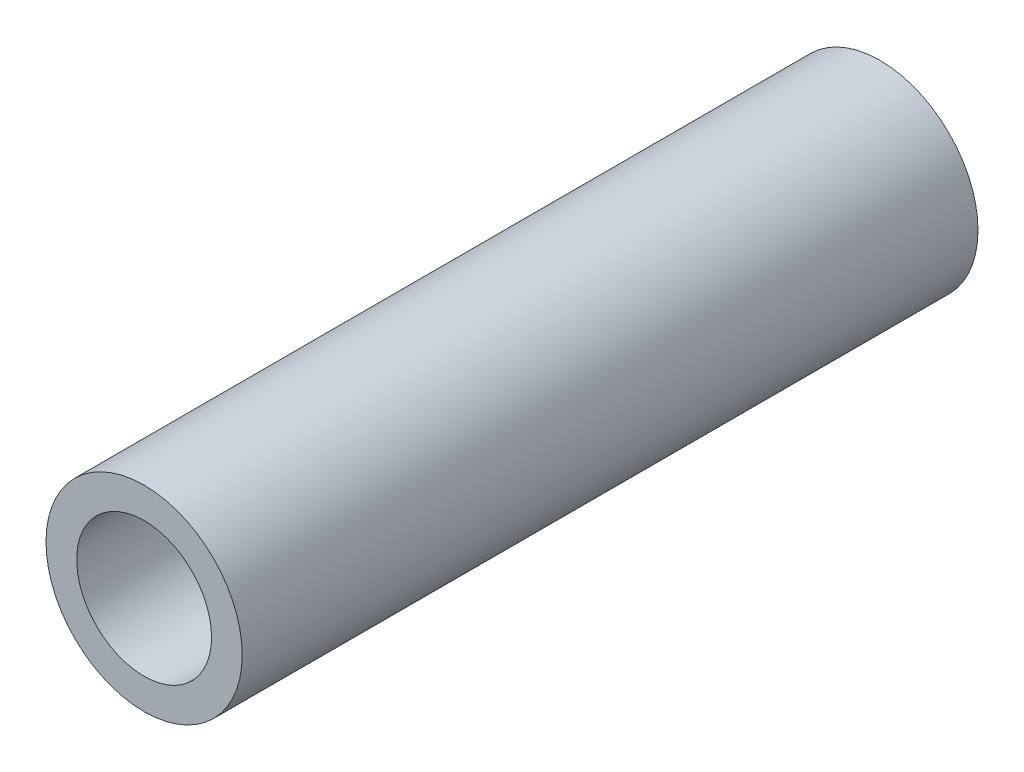
ISO-10303-21;
HEADER;
FILE_DESCRIPTION(('STEP AP214'),'2;1');
FILE_NAME('part.step','',(''),(''),'','','');
FILE_SCHEMA(('AUTOMOTIVE_DESIGN { 1 0 10303 214 1 1 1 1 }'));
ENDSEC;
DATA;
#1=APPLICATION_CONTEXT('core data for automotive mechanical design processes');
#2=APPLICATION_PROTOCOL_DEFINITION('international standard','automotive_design',2000,#1);
#3=PRODUCT_CONTEXT('',#1,'mechanical');
#4=PRODUCT('Part','Part','',(#3));
#5=PRODUCT_RELATED_PRODUCT_CATEGORY('part','',(#4));
#6=PRODUCT_DEFINITION_FORMATION('','',#4);
#7=PRODUCT_DEFINITION_CONTEXT('part definition',#1,'design');
#8=PRODUCT_DEFINITION('design','',#6,#7);
#9=PRODUCT_DEFINITION_SHAPE('','',#8);
#10=(LENGTH_UNIT() NAMED_UNIT(*) SI_UNIT(.MILLI.,.METRE.));
#11=(NAMED_UNIT(*) PLANE_ANGLE_UNIT() SI_UNIT($,.RADIAN.));
#12=(NAMED_UNIT(*) SI_UNIT($,.STERADIAN.) SOLID_ANGLE_UNIT());
#13=UNCERTAINTY_MEASURE_WITH_UNIT(LENGTH_MEASURE(1.E-05),#10,'distance_accuracy_value','');
#14=(GEOMETRIC_REPRESENTATION_CONTEXT(3) GLOBAL_UNCERTAINTY_ASSIGNED_CONTEXT((#13)) GLOBAL_UNIT_ASSIGNED_CONTEXT((#10,
#11,#12)) REPRESENTATION_CONTEXT('',''));
#15=CARTESIAN_POINT('',(0.,0.,0.));
#16=DIRECTION('',(0.,0.,1.));
#17=DIRECTION('',(1.,0.,0.));
#18=AXIS2_PLACEMENT_3D('',#15,#16,#17);
#19=CARTESIAN_POINT('',(0.,0.,-60.));
#20=DIRECTION('',(0.,0.,1.));
#21=DIRECTION('',(1.,0.,0.));
#22=AXIS2_PLACEMENT_3D('',#19,#20,#21);
#23=CYLINDRICAL_SURFACE('',#22,8.);
#24=CARTESIAN_POINT('',(0.,0.,-60.));
#25=DIRECTION('',(0.,0.,1.));
#26=DIRECTION('',(1.,0.,0.));
#27=AXIS2_PLACEMENT_3D('',#24,#25,#26);
#28=CIRCLE('',#27,8.);
#29=CARTESIAN_POINT('',(8.,0.,-60.));
#30=VERTEX_POINT('',#29);
#31=EDGE_CURVE('E10',#30,#30,#28,.T.);
#32=ORIENTED_EDGE('',*,*,#31,.T.);
#33=EDGE_LOOP('',(#32));
#34=FACE_BOUND('',#33,.T.);
#35=CARTESIAN_POINT('',(0.,0.,0.));
#36=DIRECTION('',(0.,0.,1.));
#37=DIRECTION('',(1.,0.,0.));
#38=AXIS2_PLACEMENT_3D('',#35,#36,#37);
#39=CIRCLE('',#38,8.);
#40=CARTESIAN_POINT('',(8.,0.,0.));
#41=VERTEX_POINT('',#40);
#42=EDGE_CURVE('E34',#41,#41,#39,.T.);
#43=ORIENTED_EDGE('',*,*,#42,.F.);
#44=EDGE_LOOP('',(#43));
#45=FACE_BOUND('',#44,.T.);
#46=ADVANCED_FACE('F31',(#34,#45),#23,.T.);
#47=CARTESIAN_POINT('',(0.,0.,-60.));
#48=DIRECTION('',(0.,0.,1.));
#49=DIRECTION('',(1.,0.,0.));
#50=AXIS2_PLACEMENT_3D('',#47,#48,#49);
#51=PLANE('',#50);
#52=CARTESIAN_POINT('',(0.,0.,-60.));
#53=DIRECTION('',(0.,0.,1.));
#54=DIRECTION('',(1.,0.,0.));
#55=AXIS2_PLACEMENT_3D('',#52,#53,#54);
#56=CIRCLE('',#55,5.5);
#57=CARTESIAN_POINT('',(5.5,0.,-60.));
#58=VERTEX_POINT('',#57);
#59=EDGE_CURVE('E41',#58,#58,#56,.T.);
#60=ORIENTED_EDGE('',*,*,#59,.T.);
#61=EDGE_LOOP('',(#60));
#62=FACE_BOUND('',#61,.T.);
#63=ORIENTED_EDGE('',*,*,#31,.F.);
#64=EDGE_LOOP('',(#63));
#65=FACE_BOUND('',#64,.T.);
#66=ADVANCED_FACE('F49',(#62,#65),#51,.F.);
#67=CARTESIAN_POINT('',(0.,0.,0.));
#68=DIRECTION('',(0.,0.,1.));
#69=DIRECTION('',(1.,0.,0.));
#70=AXIS2_PLACEMENT_3D('',#67,#68,#69);
#71=PLANE('',#70);
#72=CARTESIAN_POINT('',(0.,0.,0.));
#73=DIRECTION('',(0.,0.,1.));
#74=DIRECTION('',(1.,0.,0.));
#75=AXIS2_PLACEMENT_3D('',#72,#73,#74);
#76=CIRCLE('',#75,5.5);
#77=CARTESIAN_POINT('',(5.5,0.,0.));
#78=VERTEX_POINT('',#77);
#79=EDGE_CURVE('E43',#78,#78,#76,.T.);
#80=ORIENTED_EDGE('',*,*,#79,.F.);
#81=EDGE_LOOP('',(#80));
#82=FACE_BOUND('',#81,.T.);
#83=ORIENTED_EDGE('',*,*,#42,.T.);
#84=EDGE_LOOP('',(#83));
#85=FACE_BOUND('',#84,.T.);
#86=ADVANCED_FACE('F55',(#82,#85),#71,.T.);
#87=CARTESIAN_POINT('',(0.,0.,-60.));
#88=DIRECTION('',(0.,0.,1.));
#89=DIRECTION('',(1.,0.,0.));
#90=AXIS2_PLACEMENT_3D('',#87,#88,#89);
#91=CYLINDRICAL_SURFACE('',#90,5.5);
#92=ORIENTED_EDGE('',*,*,#59,.F.);
#93=EDGE_LOOP('',(#92));
#94=FACE_BOUND('',#93,.T.);
#95=ORIENTED_EDGE('',*,*,#79,.T.);
#96=EDGE_LOOP('',(#95));
#97=FACE_BOUND('',#96,.T.);
#98=ADVANCED_FACE('F52',(#94,#97),#91,.F.);
#99=CLOSED_SHELL('',(#46,#66,#86,#98));
#100=MANIFOLD_SOLID_BREP('B2',#99);
#101=ADVANCED_BREP_SHAPE_REPRESENTATION('',(#18,#100),#14);
#102=SHAPE_DEFINITION_REPRESENTATION(#9,#101);
ENDSEC;
END-ISO-10303-21;
